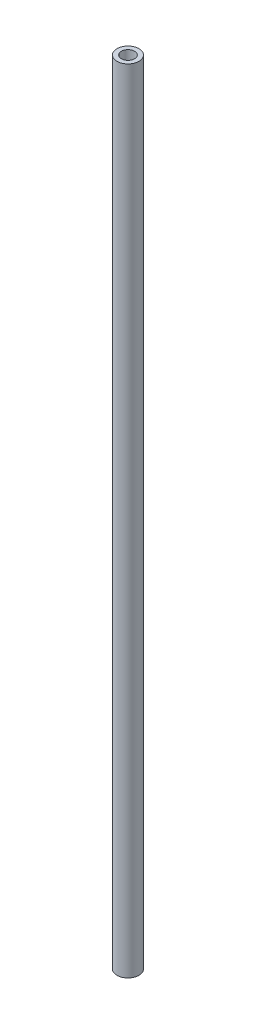
ISO-10303-21;
HEADER;
FILE_DESCRIPTION(('STEP AP214'),'2;1');
FILE_NAME('part.step','',(''),(''),'','','');
FILE_SCHEMA(('AUTOMOTIVE_DESIGN { 1 0 10303 214 1 1 1 1 }'));
ENDSEC;
DATA;
#1=APPLICATION_CONTEXT('core data for automotive mechanical design processes');
#2=APPLICATION_PROTOCOL_DEFINITION('international standard','automotive_design',2000,#1);
#3=PRODUCT_CONTEXT('',#1,'mechanical');
#4=PRODUCT('Part','Part','',(#3));
#5=PRODUCT_RELATED_PRODUCT_CATEGORY('part','',(#4));
#6=PRODUCT_DEFINITION_FORMATION('','',#4);
#7=PRODUCT_DEFINITION_CONTEXT('part definition',#1,'design');
#8=PRODUCT_DEFINITION('design','',#6,#7);
#9=PRODUCT_DEFINITION_SHAPE('','',#8);
#10=(LENGTH_UNIT() NAMED_UNIT(*) SI_UNIT(.MILLI.,.METRE.));
#11=(NAMED_UNIT(*) PLANE_ANGLE_UNIT() SI_UNIT($,.RADIAN.));
#12=(NAMED_UNIT(*) SI_UNIT($,.STERADIAN.) SOLID_ANGLE_UNIT());
#13=UNCERTAINTY_MEASURE_WITH_UNIT(LENGTH_MEASURE(1.E-05),#10,'distance_accuracy_value','');
#14=(GEOMETRIC_REPRESENTATION_CONTEXT(3) GLOBAL_UNCERTAINTY_ASSIGNED_CONTEXT((#13)) GLOBAL_UNIT_ASSIGNED_CONTEXT((#10,
#11,#12)) REPRESENTATION_CONTEXT('',''));
#15=CARTESIAN_POINT('',(0.,0.,0.));
#16=DIRECTION('',(0.,0.,1.));
#17=DIRECTION('',(1.,0.,0.));
#18=AXIS2_PLACEMENT_3D('',#15,#16,#17);
#19=CARTESIAN_POINT('',(0.,900.,0.));
#20=DIRECTION('',(0.,-1.,0.));
#21=DIRECTION('',(0.,0.,-1.));
#22=AXIS2_PLACEMENT_3D('',#19,#20,#21);
#23=CYLINDRICAL_SURFACE('',#22,7.5);
#24=CARTESIAN_POINT('',(0.,900.,0.));
#25=DIRECTION('',(0.,1.,0.));
#26=DIRECTION('',(0.,0.,1.));
#27=AXIS2_PLACEMENT_3D('',#24,#25,#26);
#28=CIRCLE('',#27,7.5);
#29=CARTESIAN_POINT('',(0.,900.,7.5));
#30=VERTEX_POINT('',#29);
#31=EDGE_CURVE('E48',#30,#30,#28,.T.);
#32=ORIENTED_EDGE('',*,*,#31,.T.);
#33=EDGE_LOOP('',(#32));
#34=FACE_BOUND('',#33,.T.);
#35=CARTESIAN_POINT('',(0.,0.,0.));
#36=DIRECTION('',(0.,1.,0.));
#37=DIRECTION('',(0.,0.,1.));
#38=AXIS2_PLACEMENT_3D('',#35,#36,#37);
#39=CIRCLE('',#38,7.5);
#40=CARTESIAN_POINT('',(0.,0.,7.5));
#41=VERTEX_POINT('',#40);
#42=EDGE_CURVE('E54',#41,#41,#39,.T.);
#43=ORIENTED_EDGE('',*,*,#42,.F.);
#44=EDGE_LOOP('',(#43));
#45=FACE_BOUND('',#44,.T.);
#46=ADVANCED_FACE('F41',(#34,#45),#23,.F.);
#47=CARTESIAN_POINT('',(0.,900.,0.));
#48=DIRECTION('',(0.,-1.,0.));
#49=DIRECTION('',(0.,0.,-1.));
#50=AXIS2_PLACEMENT_3D('',#47,#48,#49);
#51=CYLINDRICAL_SURFACE('',#50,12.5);
#52=CARTESIAN_POINT('',(0.,900.,0.));
#53=DIRECTION('',(0.,1.,0.));
#54=DIRECTION('',(0.,0.,1.));
#55=AXIS2_PLACEMENT_3D('',#52,#53,#54);
#56=CIRCLE('',#55,12.5);
#57=CARTESIAN_POINT('',(0.,900.,12.5));
#58=VERTEX_POINT('',#57);
#59=EDGE_CURVE('E10',#58,#58,#56,.T.);
#60=ORIENTED_EDGE('',*,*,#59,.F.);
#61=EDGE_LOOP('',(#60));
#62=FACE_BOUND('',#61,.T.);
#63=CARTESIAN_POINT('',(0.,0.,0.));
#64=DIRECTION('',(0.,1.,0.));
#65=DIRECTION('',(0.,0.,1.));
#66=AXIS2_PLACEMENT_3D('',#63,#64,#65);
#67=CIRCLE('',#66,12.5);
#68=CARTESIAN_POINT('',(0.,0.,12.5));
#69=VERTEX_POINT('',#68);
#70=EDGE_CURVE('E44',#69,#69,#67,.T.);
#71=ORIENTED_EDGE('',*,*,#70,.T.);
#72=EDGE_LOOP('',(#71));
#73=FACE_BOUND('',#72,.T.);
#74=ADVANCED_FACE('F61',(#62,#73),#51,.T.);
#75=CARTESIAN_POINT('',(0.,900.,0.));
#76=DIRECTION('',(0.,1.,0.));
#77=DIRECTION('',(0.,0.,1.));
#78=AXIS2_PLACEMENT_3D('',#75,#76,#77);
#79=PLANE('',#78);
#80=ORIENTED_EDGE('',*,*,#31,.F.);
#81=EDGE_LOOP('',(#80));
#82=FACE_BOUND('',#81,.T.);
#83=ORIENTED_EDGE('',*,*,#59,.T.);
#84=EDGE_LOOP('',(#83));
#85=FACE_BOUND('',#84,.T.);
#86=ADVANCED_FACE('F65',(#82,#85),#79,.T.);
#87=CARTESIAN_POINT('',(0.,0.,0.));
#88=DIRECTION('',(0.,1.,0.));
#89=DIRECTION('',(0.,0.,1.));
#90=AXIS2_PLACEMENT_3D('',#87,#88,#89);
#91=PLANE('',#90);
#92=ORIENTED_EDGE('',*,*,#42,.T.);
#93=EDGE_LOOP('',(#92));
#94=FACE_BOUND('',#93,.T.);
#95=ORIENTED_EDGE('',*,*,#70,.F.);
#96=EDGE_LOOP('',(#95));
#97=FACE_BOUND('',#96,.T.);
#98=ADVANCED_FACE('F63',(#94,#97),#91,.F.);
#99=CLOSED_SHELL('',(#46,#74,#86,#98));
#100=MANIFOLD_SOLID_BREP('B2',#99);
#101=ADVANCED_BREP_SHAPE_REPRESENTATION('',(#18,#100),#14);
#102=SHAPE_DEFINITION_REPRESENTATION(#9,#101);
ENDSEC;
END-ISO-10303-21;
